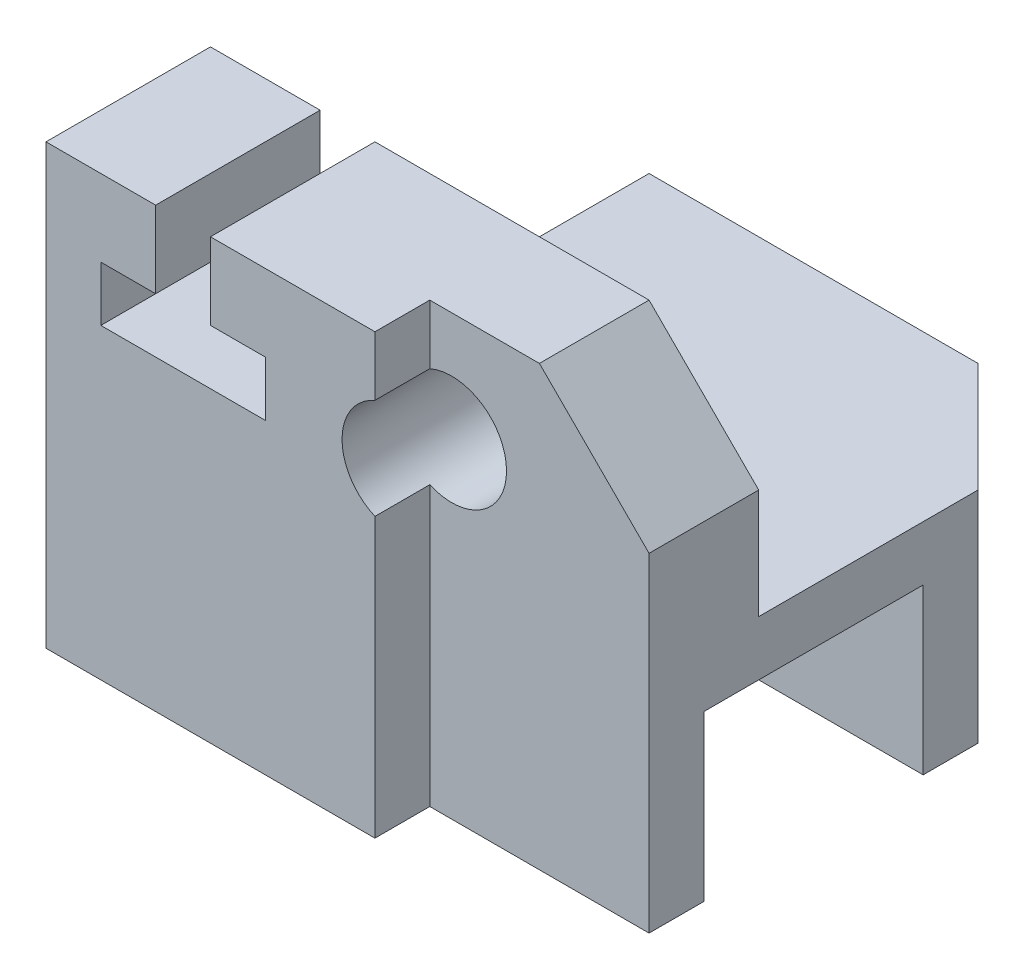
ISO-10303-21;
HEADER;
FILE_DESCRIPTION(('STEP AP214'),'2;1');
FILE_NAME('part.step','',(''),(''),'','','');
FILE_SCHEMA(('AUTOMOTIVE_DESIGN { 1 0 10303 214 1 1 1 1 }'));
ENDSEC;
DATA;
#1=APPLICATION_CONTEXT('core data for automotive mechanical design processes');
#2=APPLICATION_PROTOCOL_DEFINITION('international standard','automotive_design',2000,#1);
#3=PRODUCT_CONTEXT('',#1,'mechanical');
#4=PRODUCT('Part','Part','',(#3));
#5=PRODUCT_RELATED_PRODUCT_CATEGORY('part','',(#4));
#6=PRODUCT_DEFINITION_FORMATION('','',#4);
#7=PRODUCT_DEFINITION_CONTEXT('part definition',#1,'design');
#8=PRODUCT_DEFINITION('design','',#6,#7);
#9=PRODUCT_DEFINITION_SHAPE('','',#8);
#10=(LENGTH_UNIT() NAMED_UNIT(*) SI_UNIT(.MILLI.,.METRE.));
#11=(NAMED_UNIT(*) PLANE_ANGLE_UNIT() SI_UNIT($,.RADIAN.));
#12=(NAMED_UNIT(*) SI_UNIT($,.STERADIAN.) SOLID_ANGLE_UNIT());
#13=UNCERTAINTY_MEASURE_WITH_UNIT(LENGTH_MEASURE(1.E-05),#10,'distance_accuracy_value','');
#14=(GEOMETRIC_REPRESENTATION_CONTEXT(3) GLOBAL_UNCERTAINTY_ASSIGNED_CONTEXT((#13)) GLOBAL_UNIT_ASSIGNED_CONTEXT((#10,
#11,#12)) REPRESENTATION_CONTEXT('',''));
#15=CARTESIAN_POINT('',(0.,0.,0.));
#16=DIRECTION('',(0.,0.,1.));
#17=DIRECTION('',(1.,0.,0.));
#18=AXIS2_PLACEMENT_3D('',#15,#16,#17);
#19=CARTESIAN_POINT('',(-59.1833674934599,0.,0.));
#20=DIRECTION('',(1.,0.,0.));
#21=DIRECTION('',(0.,0.,-1.));
#22=AXIS2_PLACEMENT_3D('',#19,#20,#21);
#23=PLANE('',#22);
#24=DIRECTION('',(0.,0.,-1.));
#25=VECTOR('',#24,1.);
#26=CARTESIAN_POINT('',(-59.1833674934599,-29.4280032993977,22.5));
#27=LINE('',#26,#25);
#28=CARTESIAN_POINT('',(-59.1833674934599,-29.4280032993977,22.5));
#29=VERTEX_POINT('',#28);
#30=CARTESIAN_POINT('',(-59.1833674934599,-29.4280032993977,17.5));
#31=VERTEX_POINT('',#30);
#32=EDGE_CURVE('E11',#29,#31,#27,.T.);
#33=ORIENTED_EDGE('',*,*,#32,.F.);
#34=DIRECTION('',(0.,-1.,0.));
#35=VECTOR('',#34,1.);
#36=CARTESIAN_POINT('',(-59.1833674934599,-14.8454276044418,22.5));
#37=LINE('',#36,#35);
#38=CARTESIAN_POINT('',(-59.1833674934599,-54.8454276044418,22.5));
#39=VERTEX_POINT('',#38);
#40=EDGE_CURVE('E247',#29,#39,#37,.T.);
#41=ORIENTED_EDGE('',*,*,#40,.T.);
#42=DIRECTION('',(0.,0.,-1.));
#43=VECTOR('',#42,1.);
#44=CARTESIAN_POINT('',(-59.1833674934599,-54.8454276044418,22.5));
#45=LINE('',#44,#43);
#46=CARTESIAN_POINT('',(-59.1833674934599,-54.8454276044418,17.5));
#47=VERTEX_POINT('',#46);
#48=EDGE_CURVE('E253',#39,#47,#45,.T.);
#49=ORIENTED_EDGE('',*,*,#48,.T.);
#50=DIRECTION('',(0.,1.,0.));
#51=VECTOR('',#50,1.);
#52=CARTESIAN_POINT('',(-59.1833674934599,-14.8454276044418,17.5));
#53=LINE('',#52,#51);
#54=EDGE_CURVE('E263',#47,#31,#53,.T.);
#55=ORIENTED_EDGE('',*,*,#54,.T.);
#56=EDGE_LOOP('',(#33,#41,#49,#55));
#57=FACE_BOUND('',#56,.T.);
#58=ADVANCED_FACE('F40',(#57),#23,.T.);
#59=CARTESIAN_POINT('',(-89.1833674934599,-54.8454276044418,22.5));
#60=DIRECTION('',(0.,1.,0.));
#61=DIRECTION('',(0.,0.,1.));
#62=AXIS2_PLACEMENT_3D('',#59,#60,#61);
#63=PLANE('',#62);
#64=DIRECTION('',(1.,0.,0.));
#65=VECTOR('',#64,1.);
#66=CARTESIAN_POINT('',(-64.1833674934599,-54.8454276044418,-7.50000000000001));
#67=LINE('',#66,#65);
#68=CARTESIAN_POINT('',(-54.1833674934599,-54.8454276044418,-7.50000000000001));
#69=VERTEX_POINT('',#68);
#70=CARTESIAN_POINT('',(-39.1833674934599,-54.8454276044418,-7.50000000000001));
#71=VERTEX_POINT('',#70);
#72=EDGE_CURVE('E63',#69,#71,#67,.T.);
#73=ORIENTED_EDGE('',*,*,#72,.F.);
#74=DIRECTION('',(0.,0.,-1.));
#75=VECTOR('',#74,1.);
#76=CARTESIAN_POINT('',(-54.1833674934599,-54.8454276044418,2.5));
#77=LINE('',#76,#75);
#78=CARTESIAN_POINT('',(-54.1833674934599,-54.8454276044418,-22.5));
#79=VERTEX_POINT('',#78);
#80=EDGE_CURVE('E349',#69,#79,#77,.T.);
#81=ORIENTED_EDGE('',*,*,#80,.T.);
#82=DIRECTION('',(1.,0.,0.));
#83=VECTOR('',#82,1.);
#84=CARTESIAN_POINT('',(-89.1833674934599,-54.8454276044418,-22.5));
#85=LINE('',#84,#83);
#86=CARTESIAN_POINT('',(-49.1833674934599,-54.8454276044418,-22.5));
#87=VERTEX_POINT('',#86);
#88=EDGE_CURVE('E308',#79,#87,#85,.T.);
#89=ORIENTED_EDGE('',*,*,#88,.T.);
#90=DIRECTION('',(0.707106781186548,0.,0.707106781186547));
#91=VECTOR('',#90,1.);
#92=CARTESIAN_POINT('',(-39.1833674934599,-54.8454276044418,-12.5));
#93=LINE('',#92,#91);
#94=CARTESIAN_POINT('',(-39.1833674934599,-54.8454276044418,-12.5));
#95=VERTEX_POINT('',#94);
#96=EDGE_CURVE('E337',#87,#95,#93,.T.);
#97=ORIENTED_EDGE('',*,*,#96,.T.);
#98=DIRECTION('',(0.,0.,-1.));
#99=VECTOR('',#98,1.);
#100=CARTESIAN_POINT('',(-39.1833674934599,-54.8454276044418,22.5));
#101=LINE('',#100,#99);
#102=EDGE_CURVE('E313',#71,#95,#101,.T.);
#103=ORIENTED_EDGE('',*,*,#102,.F.);
#104=EDGE_LOOP('',(#73,#81,#89,#97,#103));
#105=FACE_BOUND('',#104,.T.);
#106=ADVANCED_FACE('F348',(#105),#63,.F.);
#107=CARTESIAN_POINT('',(-89.1833674934599,-14.8454276044418,22.5));
#108=DIRECTION('',(0.,-1.,0.));
#109=DIRECTION('',(0.,0.,-1.));
#110=AXIS2_PLACEMENT_3D('',#107,#108,#109);
#111=PLANE('',#110);
#112=DIRECTION('',(1.,0.,0.));
#113=VECTOR('',#112,1.);
#114=CARTESIAN_POINT('',(-89.1833674934599,-14.8454276044418,7.5));
#115=LINE('',#114,#113);
#116=CARTESIAN_POINT('',(-74.1833674934599,-14.8454276044418,7.5));
#117=VERTEX_POINT('',#116);
#118=CARTESIAN_POINT('',(-49.1833674934599,-14.8454276044418,7.5));
#119=VERTEX_POINT('',#118);
#120=EDGE_CURVE('E283',#117,#119,#115,.T.);
#121=ORIENTED_EDGE('',*,*,#120,.F.);
#122=DIRECTION('',(0.,0.,-1.));
#123=VECTOR('',#122,1.);
#124=CARTESIAN_POINT('',(-74.1833674934599,-14.8454276044418,22.5));
#125=LINE('',#124,#123);
#126=CARTESIAN_POINT('',(-74.1833674934599,-14.8454276044418,22.5));
#127=VERTEX_POINT('',#126);
#128=EDGE_CURVE('E401',#127,#117,#125,.T.);
#129=ORIENTED_EDGE('',*,*,#128,.F.);
#130=DIRECTION('',(-1.,0.,0.));
#131=VECTOR('',#130,1.);
#132=CARTESIAN_POINT('',(-89.1833674934599,-14.8454276044418,22.5));
#133=LINE('',#132,#131);
#134=CARTESIAN_POINT('',(-59.1833674934599,-14.8454276044418,22.5));
#135=VERTEX_POINT('',#134);
#136=EDGE_CURVE('E304',#135,#127,#133,.T.);
#137=ORIENTED_EDGE('',*,*,#136,.F.);
#138=DIRECTION('',(0.,0.,1.));
#139=VECTOR('',#138,1.);
#140=CARTESIAN_POINT('',(-59.1833674934599,-14.8454276044418,22.5));
#141=LINE('',#140,#139);
#142=CARTESIAN_POINT('',(-59.1833674934599,-14.8454276044418,17.5));
#143=VERTEX_POINT('',#142);
#144=EDGE_CURVE('E252',#143,#135,#141,.T.);
#145=ORIENTED_EDGE('',*,*,#144,.F.);
#146=DIRECTION('',(1.,0.,0.));
#147=VECTOR('',#146,1.);
#148=CARTESIAN_POINT('',(-59.1833674934599,-14.8454276044418,17.5));
#149=LINE('',#148,#147);
#150=CARTESIAN_POINT('',(-49.1833674934599,-14.8454276044418,17.5));
#151=VERTEX_POINT('',#150);
#152=EDGE_CURVE('E271',#143,#151,#149,.T.);
#153=ORIENTED_EDGE('',*,*,#152,.T.);
#154=DIRECTION('',(0.,0.,-1.));
#155=VECTOR('',#154,1.);
#156=CARTESIAN_POINT('',(-49.1833674934599,-14.8454276044418,22.5));
#157=LINE('',#156,#155);
#158=EDGE_CURVE('E320',#151,#119,#157,.T.);
#159=ORIENTED_EDGE('',*,*,#158,.T.);
#160=EDGE_LOOP('',(#121,#129,#137,#145,#153,#159));
#161=FACE_BOUND('',#160,.T.);
#162=ADVANCED_FACE('F545',(#161),#111,.F.);
#163=CARTESIAN_POINT('',(0.,0.,22.5));
#164=DIRECTION('',(0.,0.,-1.));
#165=DIRECTION('',(-1.,0.,0.));
#166=AXIS2_PLACEMENT_3D('',#163,#164,#165);
#167=PLANE('',#166);
#168=ORIENTED_EDGE('',*,*,#40,.F.);
#169=CARTESIAN_POINT('',(-57.1833674934599,-24.8454276044418,22.5));
#170=DIRECTION('',(0.,0.,-1.));
#171=DIRECTION('',(-1.,0.,0.));
#172=AXIS2_PLACEMENT_3D('',#169,#170,#171);
#173=CIRCLE('',#172,5.);
#174=CARTESIAN_POINT('',(-59.1833674934599,-20.262851909486,22.5));
#175=VERTEX_POINT('',#174);
#176=EDGE_CURVE('E233',#29,#175,#173,.T.);
#177=ORIENTED_EDGE('',*,*,#176,.T.);
#178=EDGE_CURVE('E244',#135,#175,#37,.T.);
#179=ORIENTED_EDGE('',*,*,#178,.F.);
#180=ORIENTED_EDGE('',*,*,#136,.T.);
#181=DIRECTION('',(0.,-1.,0.));
#182=VECTOR('',#181,1.);
#183=CARTESIAN_POINT('',(-74.1833674934599,-14.8454276044418,22.5));
#184=LINE('',#183,#182);
#185=CARTESIAN_POINT('',(-74.1833674934599,-21.8454276044418,22.5));
#186=VERTEX_POINT('',#185);
#187=EDGE_CURVE('E360',#127,#186,#184,.T.);
#188=ORIENTED_EDGE('',*,*,#187,.T.);
#189=DIRECTION('',(1.,0.,0.));
#190=VECTOR('',#189,1.);
#191=CARTESIAN_POINT('',(-69.1833674934599,-21.8454276044418,22.5));
#192=LINE('',#191,#190);
#193=CARTESIAN_POINT('',(-69.1833674934599,-21.8454276044418,22.5));
#194=VERTEX_POINT('',#193);
#195=EDGE_CURVE('E363',#186,#194,#192,.T.);
#196=ORIENTED_EDGE('',*,*,#195,.T.);
#197=DIRECTION('',(0.,-1.,0.));
#198=VECTOR('',#197,1.);
#199=CARTESIAN_POINT('',(-69.1833674934599,-21.8454276044418,22.5));
#200=LINE('',#199,#198);
#201=CARTESIAN_POINT('',(-69.1833674934599,-26.8454276044418,22.5));
#202=VERTEX_POINT('',#201);
#203=EDGE_CURVE('E367',#194,#202,#200,.T.);
#204=ORIENTED_EDGE('',*,*,#203,.T.);
#205=DIRECTION('',(-1.,0.,0.));
#206=VECTOR('',#205,1.);
#207=CARTESIAN_POINT('',(-69.1833674934599,-26.8454276044418,22.5));
#208=LINE('',#207,#206);
#209=CARTESIAN_POINT('',(-84.1833674934599,-26.8454276044418,22.5));
#210=VERTEX_POINT('',#209);
#211=EDGE_CURVE('E370',#202,#210,#208,.T.);
#212=ORIENTED_EDGE('',*,*,#211,.T.);
#213=DIRECTION('',(0.,1.,0.));
#214=VECTOR('',#213,1.);
#215=CARTESIAN_POINT('',(-84.1833674934599,-21.8454276044418,22.5));
#216=LINE('',#215,#214);
#217=CARTESIAN_POINT('',(-84.1833674934599,-21.8454276044418,22.5));
#218=VERTEX_POINT('',#217);
#219=EDGE_CURVE('E373',#210,#218,#216,.T.);
#220=ORIENTED_EDGE('',*,*,#219,.T.);
#221=DIRECTION('',(1.,0.,0.));
#222=VECTOR('',#221,1.);
#223=CARTESIAN_POINT('',(-79.1833674934599,-21.8454276044418,22.5));
#224=LINE('',#223,#222);
#225=CARTESIAN_POINT('',(-79.1833674934599,-21.8454276044418,22.5));
#226=VERTEX_POINT('',#225);
#227=EDGE_CURVE('E376',#218,#226,#224,.T.);
#228=ORIENTED_EDGE('',*,*,#227,.T.);
#229=DIRECTION('',(0.,1.,0.));
#230=VECTOR('',#229,1.);
#231=CARTESIAN_POINT('',(-79.1833674934599,-14.8454276044418,22.5));
#232=LINE('',#231,#230);
#233=CARTESIAN_POINT('',(-79.1833674934599,-14.8454276044418,22.5));
#234=VERTEX_POINT('',#233);
#235=EDGE_CURVE('E379',#226,#234,#232,.T.);
#236=ORIENTED_EDGE('',*,*,#235,.T.);
#237=CARTESIAN_POINT('',(-89.1833674934599,-14.8454276044418,22.5));
#238=VERTEX_POINT('',#237);
#239=EDGE_CURVE('E303',#234,#238,#133,.T.);
#240=ORIENTED_EDGE('',*,*,#239,.T.);
#241=DIRECTION('',(0.,-1.,0.));
#242=VECTOR('',#241,1.);
#243=CARTESIAN_POINT('',(-89.1833674934599,-54.8454276044418,22.5));
#244=LINE('',#243,#242);
#245=CARTESIAN_POINT('',(-89.1833674934599,-54.8454276044418,22.5));
#246=VERTEX_POINT('',#245);
#247=EDGE_CURVE('E297',#238,#246,#244,.T.);
#248=ORIENTED_EDGE('',*,*,#247,.T.);
#249=DIRECTION('',(1.,0.,0.));
#250=VECTOR('',#249,1.);
#251=CARTESIAN_POINT('',(-89.1833674934599,-54.8454276044418,22.5));
#252=LINE('',#251,#250);
#253=EDGE_CURVE('E300',#246,#39,#252,.T.);
#254=ORIENTED_EDGE('',*,*,#253,.T.);
#255=EDGE_LOOP('',(#168,#177,#179,#180,#188,#196,#204,#212,#220,#228,#236,#240,#248,#254));
#256=FACE_BOUND('',#255,.T.);
#257=ADVANCED_FACE('F242',(#256),#167,.F.);
#258=CARTESIAN_POINT('',(-89.1833674934599,-54.8454276044418,22.5));
#259=DIRECTION('',(1.,0.,0.));
#260=DIRECTION('',(0.,0.,-1.));
#261=AXIS2_PLACEMENT_3D('',#258,#259,#260);
#262=PLANE('',#261);
#263=DIRECTION('',(0.,0.,-1.));
#264=VECTOR('',#263,1.);
#265=CARTESIAN_POINT('',(-89.1833674934599,-34.8454276044418,-22.5));
#266=LINE('',#265,#264);
#267=CARTESIAN_POINT('',(-89.1833674934599,-34.8454276044418,7.5));
#268=VERTEX_POINT('',#267);
#269=CARTESIAN_POINT('',(-89.1833674934599,-34.8454276044418,-7.5));
#270=VERTEX_POINT('',#269);
#271=EDGE_CURVE('E279',#268,#270,#266,.T.);
#272=ORIENTED_EDGE('',*,*,#271,.T.);
#273=DIRECTION('',(0.,1.,0.));
#274=VECTOR('',#273,1.);
#275=CARTESIAN_POINT('',(-89.1833674934599,-34.8454276044418,-7.5));
#276=LINE('',#275,#274);
#277=CARTESIAN_POINT('',(-89.1833674934599,-44.8454276044418,-7.5));
#278=VERTEX_POINT('',#277);
#279=EDGE_CURVE('E423',#278,#270,#276,.T.);
#280=ORIENTED_EDGE('',*,*,#279,.F.);
#281=DIRECTION('',(0.,0.,1.));
#282=VECTOR('',#281,1.);
#283=CARTESIAN_POINT('',(-89.1833674934599,-44.8454276044418,-22.5));
#284=LINE('',#283,#282);
#285=CARTESIAN_POINT('',(-89.1833674934599,-44.8454276044418,-22.5));
#286=VERTEX_POINT('',#285);
#287=EDGE_CURVE('E403',#286,#278,#284,.T.);
#288=ORIENTED_EDGE('',*,*,#287,.F.);
#289=DIRECTION('',(0.,-1.,0.));
#290=VECTOR('',#289,1.);
#291=CARTESIAN_POINT('',(-89.1833674934599,-54.8454276044418,-22.5));
#292=LINE('',#291,#290);
#293=CARTESIAN_POINT('',(-89.1833674934599,-54.8454276044418,-22.5));
#294=VERTEX_POINT('',#293);
#295=EDGE_CURVE('E290',#286,#294,#292,.T.);
#296=ORIENTED_EDGE('',*,*,#295,.T.);
#297=DIRECTION('',(0.,0.,-1.));
#298=VECTOR('',#297,1.);
#299=CARTESIAN_POINT('',(-89.1833674934599,-54.8454276044418,22.5));
#300=LINE('',#299,#298);
#301=EDGE_CURVE('E317',#246,#294,#300,.T.);
#302=ORIENTED_EDGE('',*,*,#301,.F.);
#303=ORIENTED_EDGE('',*,*,#247,.F.);
#304=DIRECTION('',(0.,0.,-1.));
#305=VECTOR('',#304,1.);
#306=CARTESIAN_POINT('',(-89.1833674934599,-14.8454276044418,22.5));
#307=LINE('',#306,#305);
#308=CARTESIAN_POINT('',(-89.1833674934599,-14.8454276044418,7.5));
#309=VERTEX_POINT('',#308);
#310=EDGE_CURVE('E306',#238,#309,#307,.T.);
#311=ORIENTED_EDGE('',*,*,#310,.T.);
#312=DIRECTION('',(0.,-1.,0.));
#313=VECTOR('',#312,1.);
#314=CARTESIAN_POINT('',(-89.1833674934599,-14.8454276044418,7.5));
#315=LINE('',#314,#313);
#316=EDGE_CURVE('E276',#309,#268,#315,.T.);
#317=ORIENTED_EDGE('',*,*,#316,.T.);
#318=EDGE_LOOP('',(#272,#280,#288,#296,#302,#303,#311,#317));
#319=FACE_BOUND('',#318,.T.);
#320=ADVANCED_FACE('F446',(#319),#262,.F.);
#321=CARTESIAN_POINT('',(-74.1833674934599,-54.8454276044418,-3.5));
#322=DIRECTION('',(0.,1.,0.));
#323=DIRECTION('',(0.,0.,1.));
#324=AXIS2_PLACEMENT_3D('',#321,#322,#323);
#325=CIRCLE('',#324,3.00000000000001);
#326=CARTESIAN_POINT('',(-74.1833674934599,-54.8454276044418,-0.499999999999992));
#327=VERTEX_POINT('',#326);
#328=EDGE_CURVE('E493',#327,#327,#325,.T.);
#329=ORIENTED_EDGE('',*,*,#328,.T.);
#330=EDGE_LOOP('',(#329));
#331=FACE_BOUND('',#330,.T.);
#332=CARTESIAN_POINT('',(-64.1833674934599,-54.8454276044418,-22.5));
#333=VERTEX_POINT('',#332);
#334=EDGE_CURVE('E301',#294,#333,#85,.T.);
#335=ORIENTED_EDGE('',*,*,#334,.T.);
#336=DIRECTION('',(0.,0.,-1.));
#337=VECTOR('',#336,1.);
#338=CARTESIAN_POINT('',(-64.1833674934599,-54.8454276044418,12.5));
#339=LINE('',#338,#337);
#340=CARTESIAN_POINT('',(-64.1833674934599,-54.8454276044418,12.5));
#341=VERTEX_POINT('',#340);
#342=EDGE_CURVE('E509',#341,#333,#339,.T.);
#343=ORIENTED_EDGE('',*,*,#342,.F.);
#344=DIRECTION('',(1.,0.,0.));
#345=VECTOR('',#344,1.);
#346=CARTESIAN_POINT('',(-64.1833674934599,-54.8454276044418,12.5));
#347=LINE('',#346,#345);
#348=CARTESIAN_POINT('',(-39.1833674934599,-54.8454276044418,12.5));
#349=VERTEX_POINT('',#348);
#350=EDGE_CURVE('E351',#341,#349,#347,.T.);
#351=ORIENTED_EDGE('',*,*,#350,.T.);
#352=CARTESIAN_POINT('',(-39.1833674934599,-54.8454276044418,17.5));
#353=VERTEX_POINT('',#352);
#354=EDGE_CURVE('E314',#353,#349,#101,.T.);
#355=ORIENTED_EDGE('',*,*,#354,.F.);
#356=DIRECTION('',(1.,0.,0.));
#357=VECTOR('',#356,1.);
#358=CARTESIAN_POINT('',(-59.1833674934599,-54.8454276044418,17.5));
#359=LINE('',#358,#357);
#360=EDGE_CURVE('E267',#47,#353,#359,.T.);
#361=ORIENTED_EDGE('',*,*,#360,.F.);
#362=ORIENTED_EDGE('',*,*,#48,.F.);
#363=ORIENTED_EDGE('',*,*,#253,.F.);
#364=ORIENTED_EDGE('',*,*,#301,.T.);
#365=EDGE_LOOP('',(#335,#343,#351,#355,#361,#362,#363,#364));
#366=FACE_BOUND('',#365,.T.);
#367=ADVANCED_FACE('F457',(#331,#366),#63,.F.);
#368=CARTESIAN_POINT('',(-39.1833674934599,-54.8454276044418,22.5));
#369=DIRECTION('',(-1.,0.,0.));
#370=DIRECTION('',(0.,0.,1.));
#371=AXIS2_PLACEMENT_3D('',#368,#369,#370);
#372=PLANE('',#371);
#373=ORIENTED_EDGE('',*,*,#354,.T.);
#374=DIRECTION('',(0.,-1.,0.));
#375=VECTOR('',#374,1.);
#376=CARTESIAN_POINT('',(-39.1833674934599,-54.8454276044418,12.5));
#377=LINE('',#376,#375);
#378=CARTESIAN_POINT('',(-39.1833674934599,-39.8454276044418,12.5));
#379=VERTEX_POINT('',#378);
#380=EDGE_CURVE('E504',#379,#349,#377,.T.);
#381=ORIENTED_EDGE('',*,*,#380,.F.);
#382=DIRECTION('',(0.,0.,1.));
#383=VECTOR('',#382,1.);
#384=CARTESIAN_POINT('',(-39.1833674934599,-39.8454276044418,12.5));
#385=LINE('',#384,#383);
#386=CARTESIAN_POINT('',(-39.1833674934599,-39.8454276044418,-7.50000000000001));
#387=VERTEX_POINT('',#386);
#388=EDGE_CURVE('E510',#387,#379,#385,.T.);
#389=ORIENTED_EDGE('',*,*,#388,.F.);
#390=DIRECTION('',(0.,1.,0.));
#391=VECTOR('',#390,1.);
#392=CARTESIAN_POINT('',(-39.1833674934599,-54.8454276044418,-7.50000000000001));
#393=LINE('',#392,#391);
#394=EDGE_CURVE('E489',#71,#387,#393,.T.);
#395=ORIENTED_EDGE('',*,*,#394,.F.);
#396=ORIENTED_EDGE('',*,*,#102,.T.);
#397=DIRECTION('',(0.,1.,0.));
#398=VECTOR('',#397,1.);
#399=CARTESIAN_POINT('',(-39.1833674934599,-34.8454276044418,-12.5));
#400=LINE('',#399,#398);
#401=CARTESIAN_POINT('',(-39.1833674934599,-34.8454276044418,-12.5));
#402=VERTEX_POINT('',#401);
#403=EDGE_CURVE('E329',#95,#402,#400,.T.);
#404=ORIENTED_EDGE('',*,*,#403,.T.);
#405=DIRECTION('',(0.,0.,-1.));
#406=VECTOR('',#405,1.);
#407=CARTESIAN_POINT('',(-39.1833674934599,-34.8454276044418,-22.5));
#408=LINE('',#407,#406);
#409=CARTESIAN_POINT('',(-39.1833674934599,-34.8454276044418,7.5));
#410=VERTEX_POINT('',#409);
#411=EDGE_CURVE('E280',#410,#402,#408,.T.);
#412=ORIENTED_EDGE('',*,*,#411,.F.);
#413=DIRECTION('',(0.,-1.,0.));
#414=VECTOR('',#413,1.);
#415=CARTESIAN_POINT('',(-39.1833674934599,-14.8454276044418,7.5));
#416=LINE('',#415,#414);
#417=CARTESIAN_POINT('',(-39.1833674934599,-24.8454276044419,7.5));
#418=VERTEX_POINT('',#417);
#419=EDGE_CURVE('E274',#418,#410,#416,.T.);
#420=ORIENTED_EDGE('',*,*,#419,.F.);
#421=DIRECTION('',(0.,0.,1.));
#422=VECTOR('',#421,1.);
#423=CARTESIAN_POINT('',(-39.1833674934599,-24.8454276044419,22.5));
#424=LINE('',#423,#422);
#425=CARTESIAN_POINT('',(-39.1833674934599,-24.8454276044419,17.5));
#426=VERTEX_POINT('',#425);
#427=EDGE_CURVE('E325',#418,#426,#424,.T.);
#428=ORIENTED_EDGE('',*,*,#427,.T.);
#429=DIRECTION('',(0.,1.,0.));
#430=VECTOR('',#429,1.);
#431=CARTESIAN_POINT('',(-39.1833674934599,-14.8454276044418,17.5));
#432=LINE('',#431,#430);
#433=EDGE_CURVE('E258',#353,#426,#432,.T.);
#434=ORIENTED_EDGE('',*,*,#433,.F.);
#435=EDGE_LOOP('',(#373,#381,#389,#395,#396,#404,#412,#420,#428,#434));
#436=FACE_BOUND('',#435,.T.);
#437=ADVANCED_FACE('F486',(#436),#372,.F.);
#438=ORIENTED_EDGE('',*,*,#239,.F.);
#439=DIRECTION('',(0.,0.,-1.));
#440=VECTOR('',#439,1.);
#441=CARTESIAN_POINT('',(-79.1833674934599,-14.8454276044418,22.5));
#442=LINE('',#441,#440);
#443=CARTESIAN_POINT('',(-79.1833674934599,-14.8454276044418,7.5));
#444=VERTEX_POINT('',#443);
#445=EDGE_CURVE('E404',#234,#444,#442,.T.);
#446=ORIENTED_EDGE('',*,*,#445,.T.);
#447=EDGE_CURVE('E294',#309,#444,#115,.T.);
#448=ORIENTED_EDGE('',*,*,#447,.F.);
#449=ORIENTED_EDGE('',*,*,#310,.F.);
#450=EDGE_LOOP('',(#438,#446,#448,#449));
#451=FACE_BOUND('',#450,.T.);
#452=ADVANCED_FACE('F465',(#451),#111,.F.);
#453=CARTESIAN_POINT('',(0.,0.,-22.5));
#454=DIRECTION('',(0.,0.,-1.));
#455=DIRECTION('',(-1.,0.,0.));
#456=AXIS2_PLACEMENT_3D('',#453,#454,#455);
#457=PLANE('',#456);
#458=DIRECTION('',(0.,-1.,0.));
#459=VECTOR('',#458,1.);
#460=CARTESIAN_POINT('',(-54.1833674934599,-54.8454276044418,-22.5));
#461=LINE('',#460,#459);
#462=CARTESIAN_POINT('',(-54.1833674934599,-39.8454276044418,-22.5));
#463=VERTEX_POINT('',#462);
#464=EDGE_CURVE('E490',#463,#79,#461,.T.);
#465=ORIENTED_EDGE('',*,*,#464,.F.);
#466=DIRECTION('',(1.,0.,0.));
#467=VECTOR('',#466,1.);
#468=CARTESIAN_POINT('',(-54.1833674934599,-39.8454276044418,-22.5));
#469=LINE('',#468,#467);
#470=CARTESIAN_POINT('',(-64.1833674934599,-39.8454276044418,-22.5));
#471=VERTEX_POINT('',#470);
#472=EDGE_CURVE('E492',#471,#463,#469,.T.);
#473=ORIENTED_EDGE('',*,*,#472,.F.);
#474=DIRECTION('',(0.,1.,0.));
#475=VECTOR('',#474,1.);
#476=CARTESIAN_POINT('',(-64.1833674934599,-54.8454276044418,-22.5));
#477=LINE('',#476,#475);
#478=EDGE_CURVE('E454',#333,#471,#477,.T.);
#479=ORIENTED_EDGE('',*,*,#478,.F.);
#480=ORIENTED_EDGE('',*,*,#334,.F.);
#481=ORIENTED_EDGE('',*,*,#295,.F.);
#482=DIRECTION('',(-1.,0.,0.));
#483=VECTOR('',#482,1.);
#484=CARTESIAN_POINT('',(-79.1833674934599,-44.8454276044418,-22.5));
#485=LINE('',#484,#483);
#486=CARTESIAN_POINT('',(-79.1833674934599,-44.8454276044418,-22.5));
#487=VERTEX_POINT('',#486);
#488=EDGE_CURVE('E260',#487,#286,#485,.T.);
#489=ORIENTED_EDGE('',*,*,#488,.F.);
#490=DIRECTION('',(0.,-1.,0.));
#491=VECTOR('',#490,1.);
#492=CARTESIAN_POINT('',(-79.1833674934599,-34.8454276044418,-22.5));
#493=LINE('',#492,#491);
#494=CARTESIAN_POINT('',(-79.1833674934599,-34.8454276044418,-22.5));
#495=VERTEX_POINT('',#494);
#496=EDGE_CURVE('E419',#495,#487,#493,.T.);
#497=ORIENTED_EDGE('',*,*,#496,.F.);
#498=DIRECTION('',(1.,0.,0.));
#499=VECTOR('',#498,1.);
#500=CARTESIAN_POINT('',(-89.1833674934599,-34.8454276044418,-22.5));
#501=LINE('',#500,#499);
#502=CARTESIAN_POINT('',(-49.1833674934599,-34.8454276044418,-22.5));
#503=VERTEX_POINT('',#502);
#504=EDGE_CURVE('E287',#495,#503,#501,.T.);
#505=ORIENTED_EDGE('',*,*,#504,.T.);
#506=DIRECTION('',(0.,-1.,0.));
#507=VECTOR('',#506,1.);
#508=CARTESIAN_POINT('',(-49.1833674934599,-54.8454276044418,-22.5));
#509=LINE('',#508,#507);
#510=EDGE_CURVE('E334',#503,#87,#509,.T.);
#511=ORIENTED_EDGE('',*,*,#510,.T.);
#512=ORIENTED_EDGE('',*,*,#88,.F.);
#513=EDGE_LOOP('',(#465,#473,#479,#480,#481,#489,#497,#505,#511,#512));
#514=FACE_BOUND('',#513,.T.);
#515=ADVANCED_FACE('F450',(#514),#457,.T.);
#516=CARTESIAN_POINT('',(-89.1833674934599,-34.8454276044418,-22.5));
#517=DIRECTION('',(0.,-1.,0.));
#518=DIRECTION('',(0.,0.,-1.));
#519=AXIS2_PLACEMENT_3D('',#516,#517,#518);
#520=PLANE('',#519);
#521=CARTESIAN_POINT('',(-74.1833674934599,-34.8454276044418,-3.5));
#522=DIRECTION('',(0.,1.,0.));
#523=DIRECTION('',(0.,0.,1.));
#524=AXIS2_PLACEMENT_3D('',#521,#522,#523);
#525=CIRCLE('',#524,3.00000000000001);
#526=CARTESIAN_POINT('',(-74.1833674934599,-34.8454276044418,-0.499999999999992));
#527=VERTEX_POINT('',#526);
#528=EDGE_CURVE('E497',#527,#527,#525,.T.);
#529=ORIENTED_EDGE('',*,*,#528,.F.);
#530=EDGE_LOOP('',(#529));
#531=FACE_BOUND('',#530,.T.);
#532=ORIENTED_EDGE('',*,*,#411,.T.);
#533=DIRECTION('',(-0.707106781186548,0.,-0.707106781186547));
#534=VECTOR('',#533,1.);
#535=CARTESIAN_POINT('',(-39.1833674934599,-34.8454276044418,-12.5));
#536=LINE('',#535,#534);
#537=EDGE_CURVE('E332',#402,#503,#536,.T.);
#538=ORIENTED_EDGE('',*,*,#537,.T.);
#539=ORIENTED_EDGE('',*,*,#504,.F.);
#540=DIRECTION('',(0.,0.,-1.));
#541=VECTOR('',#540,1.);
#542=CARTESIAN_POINT('',(-79.1833674934599,-34.8454276044418,-22.5));
#543=LINE('',#542,#541);
#544=CARTESIAN_POINT('',(-79.1833674934599,-34.8454276044418,-7.5));
#545=VERTEX_POINT('',#544);
#546=EDGE_CURVE('E428',#545,#495,#543,.T.);
#547=ORIENTED_EDGE('',*,*,#546,.F.);
#548=DIRECTION('',(-1.,0.,0.));
#549=VECTOR('',#548,1.);
#550=CARTESIAN_POINT('',(-79.1833674934599,-34.8454276044418,-7.5));
#551=LINE('',#550,#549);
#552=EDGE_CURVE('E270',#545,#270,#551,.T.);
#553=ORIENTED_EDGE('',*,*,#552,.T.);
#554=ORIENTED_EDGE('',*,*,#271,.F.);
#555=DIRECTION('',(1.,0.,0.));
#556=VECTOR('',#555,1.);
#557=CARTESIAN_POINT('',(-89.1833674934599,-34.8454276044418,7.5));
#558=LINE('',#557,#556);
#559=EDGE_CURVE('E291',#268,#410,#558,.T.);
#560=ORIENTED_EDGE('',*,*,#559,.T.);
#561=EDGE_LOOP('',(#532,#538,#539,#547,#553,#554,#560));
#562=FACE_BOUND('',#561,.T.);
#563=ADVANCED_FACE('F473',(#531,#562),#520,.F.);
#564=CARTESIAN_POINT('',(-89.1833674934599,-14.8454276044418,7.5));
#565=DIRECTION('',(0.,0.,1.));
#566=DIRECTION('',(1.,0.,0.));
#567=AXIS2_PLACEMENT_3D('',#564,#565,#566);
#568=PLANE('',#567);
#569=CARTESIAN_POINT('',(-57.1833674934599,-24.8454276044418,7.5));
#570=DIRECTION('',(0.,0.,-1.));
#571=DIRECTION('',(-1.,0.,0.));
#572=AXIS2_PLACEMENT_3D('',#569,#570,#571);
#573=CIRCLE('',#572,5.);
#574=CARTESIAN_POINT('',(-62.1833674934599,-24.8454276044418,7.5));
#575=VERTEX_POINT('',#574);
#576=EDGE_CURVE('E248',#575,#575,#573,.T.);
#577=ORIENTED_EDGE('',*,*,#576,.F.);
#578=EDGE_LOOP('',(#577));
#579=FACE_BOUND('',#578,.T.);
#580=DIRECTION('',(1.,0.,0.));
#581=VECTOR('',#580,1.);
#582=CARTESIAN_POINT('',(-69.1833674934599,-21.8454276044418,7.5));
#583=LINE('',#582,#581);
#584=CARTESIAN_POINT('',(-74.1833674934599,-21.8454276044418,7.5));
#585=VERTEX_POINT('',#584);
#586=CARTESIAN_POINT('',(-69.1833674934599,-21.8454276044418,7.5));
#587=VERTEX_POINT('',#586);
#588=EDGE_CURVE('E385',#585,#587,#583,.T.);
#589=ORIENTED_EDGE('',*,*,#588,.F.);
#590=DIRECTION('',(0.,-1.,0.));
#591=VECTOR('',#590,1.);
#592=CARTESIAN_POINT('',(-74.1833674934599,-14.8454276044418,7.5));
#593=LINE('',#592,#591);
#594=EDGE_CURVE('E383',#117,#585,#593,.T.);
#595=ORIENTED_EDGE('',*,*,#594,.F.);
#596=ORIENTED_EDGE('',*,*,#120,.T.);
#597=DIRECTION('',(-0.707106781186547,0.707106781186548,0.));
#598=VECTOR('',#597,1.);
#599=CARTESIAN_POINT('',(-49.1833674934599,-14.8454276044418,7.5));
#600=LINE('',#599,#598);
#601=EDGE_CURVE('E323',#119,#418,#600,.F.);
#602=ORIENTED_EDGE('',*,*,#601,.T.);
#603=ORIENTED_EDGE('',*,*,#419,.T.);
#604=ORIENTED_EDGE('',*,*,#559,.F.);
#605=ORIENTED_EDGE('',*,*,#316,.F.);
#606=ORIENTED_EDGE('',*,*,#447,.T.);
#607=DIRECTION('',(0.,1.,0.));
#608=VECTOR('',#607,1.);
#609=CARTESIAN_POINT('',(-79.1833674934599,-14.8454276044418,7.5));
#610=LINE('',#609,#608);
#611=CARTESIAN_POINT('',(-79.1833674934599,-21.8454276044418,7.5));
#612=VERTEX_POINT('',#611);
#613=EDGE_CURVE('E364',#612,#444,#610,.T.);
#614=ORIENTED_EDGE('',*,*,#613,.F.);
#615=DIRECTION('',(1.,0.,0.));
#616=VECTOR('',#615,1.);
#617=CARTESIAN_POINT('',(-79.1833674934599,-21.8454276044418,7.5));
#618=LINE('',#617,#616);
#619=CARTESIAN_POINT('',(-84.1833674934599,-21.8454276044418,7.5));
#620=VERTEX_POINT('',#619);
#621=EDGE_CURVE('E397',#620,#612,#618,.T.);
#622=ORIENTED_EDGE('',*,*,#621,.F.);
#623=DIRECTION('',(0.,1.,0.));
#624=VECTOR('',#623,1.);
#625=CARTESIAN_POINT('',(-84.1833674934599,-21.8454276044418,7.5));
#626=LINE('',#625,#624);
#627=CARTESIAN_POINT('',(-84.1833674934599,-26.8454276044418,7.5));
#628=VERTEX_POINT('',#627);
#629=EDGE_CURVE('E394',#628,#620,#626,.T.);
#630=ORIENTED_EDGE('',*,*,#629,.F.);
#631=DIRECTION('',(-1.,0.,0.));
#632=VECTOR('',#631,1.);
#633=CARTESIAN_POINT('',(-69.1833674934599,-26.8454276044418,7.5));
#634=LINE('',#633,#632);
#635=CARTESIAN_POINT('',(-69.1833674934599,-26.8454276044418,7.5));
#636=VERTEX_POINT('',#635);
#637=EDGE_CURVE('E391',#636,#628,#634,.T.);
#638=ORIENTED_EDGE('',*,*,#637,.F.);
#639=DIRECTION('',(0.,-1.,0.));
#640=VECTOR('',#639,1.);
#641=CARTESIAN_POINT('',(-69.1833674934599,-21.8454276044418,7.5));
#642=LINE('',#641,#640);
#643=EDGE_CURVE('E388',#587,#636,#642,.T.);
#644=ORIENTED_EDGE('',*,*,#643,.F.);
#645=EDGE_LOOP('',(#589,#595,#596,#602,#603,#604,#605,#606,#614,#622,#630,#638,#644));
#646=FACE_BOUND('',#645,.T.);
#647=ADVANCED_FACE('F469',(#579,#646),#568,.F.);
#648=CARTESIAN_POINT('',(-59.1833674934599,-14.8454276044418,17.5));
#649=DIRECTION('',(0.,0.,-1.));
#650=DIRECTION('',(0.,1.,0.));
#651=AXIS2_PLACEMENT_3D('',#648,#649,#650);
#652=PLANE('',#651);
#653=CARTESIAN_POINT('',(-59.1833674934599,-20.262851909486,17.5));
#654=VERTEX_POINT('',#653);
#655=EDGE_CURVE('E256',#654,#143,#53,.T.);
#656=ORIENTED_EDGE('',*,*,#655,.F.);
#657=CARTESIAN_POINT('',(-57.1833674934599,-24.8454276044418,17.5));
#658=DIRECTION('',(0.,0.,-1.));
#659=DIRECTION('',(0.,1.,0.));
#660=AXIS2_PLACEMENT_3D('',#657,#658,#659);
#661=CIRCLE('',#660,5.);
#662=EDGE_CURVE('E55',#654,#31,#661,.T.);
#663=ORIENTED_EDGE('',*,*,#662,.T.);
#664=ORIENTED_EDGE('',*,*,#54,.F.);
#665=ORIENTED_EDGE('',*,*,#360,.T.);
#666=ORIENTED_EDGE('',*,*,#433,.T.);
#667=DIRECTION('',(0.707106781186547,-0.707106781186548,0.));
#668=VECTOR('',#667,1.);
#669=CARTESIAN_POINT('',(-49.1833674934599,-14.8454276044418,17.5));
#670=LINE('',#669,#668);
#671=EDGE_CURVE('E327',#426,#151,#670,.F.);
#672=ORIENTED_EDGE('',*,*,#671,.T.);
#673=ORIENTED_EDGE('',*,*,#152,.F.);
#674=EDGE_LOOP('',(#656,#663,#664,#665,#666,#672,#673));
#675=FACE_BOUND('',#674,.T.);
#676=ADVANCED_FACE('F550',(#675),#652,.F.);
#677=DIRECTION('',(0.,0.,-1.));
#678=VECTOR('',#677,1.);
#679=CARTESIAN_POINT('',(-59.1833674934599,-20.262851909486,22.5));
#680=LINE('',#679,#678);
#681=EDGE_CURVE('E49',#654,#175,#680,.F.);
#682=ORIENTED_EDGE('',*,*,#681,.F.);
#683=ORIENTED_EDGE('',*,*,#655,.T.);
#684=ORIENTED_EDGE('',*,*,#144,.T.);
#685=ORIENTED_EDGE('',*,*,#178,.T.);
#686=EDGE_LOOP('',(#682,#683,#684,#685));
#687=FACE_BOUND('',#686,.T.);
#688=ADVANCED_FACE('F250',(#687),#23,.T.);
#689=CARTESIAN_POINT('',(-79.1833674934599,-34.8454276044418,-7.5));
#690=DIRECTION('',(0.,0.,1.));
#691=DIRECTION('',(0.,-1.,0.));
#692=AXIS2_PLACEMENT_3D('',#689,#690,#691);
#693=PLANE('',#692);
#694=ORIENTED_EDGE('',*,*,#279,.T.);
#695=ORIENTED_EDGE('',*,*,#552,.F.);
#696=DIRECTION('',(0.,1.,0.));
#697=VECTOR('',#696,1.);
#698=CARTESIAN_POINT('',(-79.1833674934599,-34.8454276044418,-7.5));
#699=LINE('',#698,#697);
#700=CARTESIAN_POINT('',(-79.1833674934599,-44.8454276044418,-7.5));
#701=VERTEX_POINT('',#700);
#702=EDGE_CURVE('E426',#701,#545,#699,.T.);
#703=ORIENTED_EDGE('',*,*,#702,.F.);
#704=DIRECTION('',(-1.,0.,0.));
#705=VECTOR('',#704,1.);
#706=CARTESIAN_POINT('',(-79.1833674934599,-44.8454276044418,-7.5));
#707=LINE('',#706,#705);
#708=EDGE_CURVE('E434',#701,#278,#707,.T.);
#709=ORIENTED_EDGE('',*,*,#708,.T.);
#710=EDGE_LOOP('',(#694,#695,#703,#709));
#711=FACE_BOUND('',#710,.T.);
#712=ADVANCED_FACE('F478',(#711),#693,.F.);
#713=CARTESIAN_POINT('',(-79.1833674934599,-44.8454276044418,-22.5));
#714=DIRECTION('',(0.,-1.,0.));
#715=DIRECTION('',(0.,0.,-1.));
#716=AXIS2_PLACEMENT_3D('',#713,#714,#715);
#717=PLANE('',#716);
#718=ORIENTED_EDGE('',*,*,#287,.T.);
#719=ORIENTED_EDGE('',*,*,#708,.F.);
#720=DIRECTION('',(0.,0.,1.));
#721=VECTOR('',#720,1.);
#722=CARTESIAN_POINT('',(-79.1833674934599,-44.8454276044418,-22.5));
#723=LINE('',#722,#721);
#724=EDGE_CURVE('E422',#487,#701,#723,.T.);
#725=ORIENTED_EDGE('',*,*,#724,.F.);
#726=ORIENTED_EDGE('',*,*,#488,.T.);
#727=EDGE_LOOP('',(#718,#719,#725,#726));
#728=FACE_BOUND('',#727,.T.);
#729=ADVANCED_FACE('F440',(#728),#717,.F.);
#730=CARTESIAN_POINT('',(-79.1833674934599,0.,0.));
#731=DIRECTION('',(-1.,0.,0.));
#732=DIRECTION('',(0.,0.,1.));
#733=AXIS2_PLACEMENT_3D('',#730,#731,#732);
#734=PLANE('',#733);
#735=ORIENTED_EDGE('',*,*,#496,.T.);
#736=ORIENTED_EDGE('',*,*,#724,.T.);
#737=ORIENTED_EDGE('',*,*,#702,.T.);
#738=ORIENTED_EDGE('',*,*,#546,.T.);
#739=EDGE_LOOP('',(#735,#736,#737,#738));
#740=FACE_BOUND('',#739,.T.);
#741=ADVANCED_FACE('F480',(#740),#734,.T.);
#742=CARTESIAN_POINT('',(-49.1833674934599,-14.8454276044418,22.5));
#743=DIRECTION('',(-0.707106781186548,-0.707106781186547,0.));
#744=DIRECTION('',(0.,0.,-1.));
#745=AXIS2_PLACEMENT_3D('',#742,#743,#744);
#746=PLANE('',#745);
#747=ORIENTED_EDGE('',*,*,#671,.F.);
#748=ORIENTED_EDGE('',*,*,#427,.F.);
#749=ORIENTED_EDGE('',*,*,#601,.F.);
#750=ORIENTED_EDGE('',*,*,#158,.F.);
#751=EDGE_LOOP('',(#747,#748,#749,#750));
#752=FACE_BOUND('',#751,.T.);
#753=ADVANCED_FACE('F578',(#752),#746,.F.);
#754=CARTESIAN_POINT('',(-39.1833674934599,-54.8454276044418,-12.5));
#755=DIRECTION('',(0.707106781186547,0.,-0.707106781186548));
#756=DIRECTION('',(0.,-1.,0.));
#757=AXIS2_PLACEMENT_3D('',#754,#755,#756);
#758=PLANE('',#757);
#759=ORIENTED_EDGE('',*,*,#96,.F.);
#760=ORIENTED_EDGE('',*,*,#510,.F.);
#761=ORIENTED_EDGE('',*,*,#537,.F.);
#762=ORIENTED_EDGE('',*,*,#403,.F.);
#763=EDGE_LOOP('',(#759,#760,#761,#762));
#764=FACE_BOUND('',#763,.T.);
#765=ADVANCED_FACE('F43',(#764),#758,.T.);
#766=CARTESIAN_POINT('',(-74.1833674934599,-14.8454276044418,22.5));
#767=DIRECTION('',(1.,0.,0.));
#768=DIRECTION('',(0.,0.,-1.));
#769=AXIS2_PLACEMENT_3D('',#766,#767,#768);
#770=PLANE('',#769);
#771=ORIENTED_EDGE('',*,*,#594,.T.);
#772=DIRECTION('',(0.,0.,-1.));
#773=VECTOR('',#772,1.);
#774=CARTESIAN_POINT('',(-74.1833674934599,-21.8454276044418,22.5));
#775=LINE('',#774,#773);
#776=EDGE_CURVE('E382',#186,#585,#775,.T.);
#777=ORIENTED_EDGE('',*,*,#776,.F.);
#778=ORIENTED_EDGE('',*,*,#187,.F.);
#779=ORIENTED_EDGE('',*,*,#128,.T.);
#780=EDGE_LOOP('',(#771,#777,#778,#779));
#781=FACE_BOUND('',#780,.T.);
#782=ADVANCED_FACE('F587',(#781),#770,.F.);
#783=CARTESIAN_POINT('',(-79.1833674934599,-14.8454276044418,22.5));
#784=DIRECTION('',(-1.,0.,0.));
#785=DIRECTION('',(0.,0.,1.));
#786=AXIS2_PLACEMENT_3D('',#783,#784,#785);
#787=PLANE('',#786);
#788=ORIENTED_EDGE('',*,*,#613,.T.);
#789=ORIENTED_EDGE('',*,*,#445,.F.);
#790=ORIENTED_EDGE('',*,*,#235,.F.);
#791=DIRECTION('',(0.,0.,-1.));
#792=VECTOR('',#791,1.);
#793=CARTESIAN_POINT('',(-79.1833674934599,-21.8454276044418,22.5));
#794=LINE('',#793,#792);
#795=EDGE_CURVE('E407',#226,#612,#794,.T.);
#796=ORIENTED_EDGE('',*,*,#795,.T.);
#797=EDGE_LOOP('',(#788,#789,#790,#796));
#798=FACE_BOUND('',#797,.T.);
#799=ADVANCED_FACE('F618',(#798),#787,.F.);
#800=CARTESIAN_POINT('',(-79.1833674934599,-21.8454276044418,22.5));
#801=DIRECTION('',(0.,1.,0.));
#802=DIRECTION('',(0.,0.,1.));
#803=AXIS2_PLACEMENT_3D('',#800,#801,#802);
#804=PLANE('',#803);
#805=ORIENTED_EDGE('',*,*,#621,.T.);
#806=ORIENTED_EDGE('',*,*,#795,.F.);
#807=ORIENTED_EDGE('',*,*,#227,.F.);
#808=DIRECTION('',(0.,0.,-1.));
#809=VECTOR('',#808,1.);
#810=CARTESIAN_POINT('',(-84.1833674934599,-21.8454276044418,22.5));
#811=LINE('',#810,#809);
#812=EDGE_CURVE('E409',#218,#620,#811,.T.);
#813=ORIENTED_EDGE('',*,*,#812,.T.);
#814=EDGE_LOOP('',(#805,#806,#807,#813));
#815=FACE_BOUND('',#814,.T.);
#816=ADVANCED_FACE('F616',(#815),#804,.F.);
#817=CARTESIAN_POINT('',(-84.1833674934599,-21.8454276044418,22.5));
#818=DIRECTION('',(-1.,0.,0.));
#819=DIRECTION('',(0.,-1.,0.));
#820=AXIS2_PLACEMENT_3D('',#817,#818,#819);
#821=PLANE('',#820);
#822=ORIENTED_EDGE('',*,*,#629,.T.);
#823=ORIENTED_EDGE('',*,*,#812,.F.);
#824=ORIENTED_EDGE('',*,*,#219,.F.);
#825=DIRECTION('',(0.,0.,-1.));
#826=VECTOR('',#825,1.);
#827=CARTESIAN_POINT('',(-84.1833674934599,-26.8454276044418,22.5));
#828=LINE('',#827,#826);
#829=EDGE_CURVE('E411',#210,#628,#828,.T.);
#830=ORIENTED_EDGE('',*,*,#829,.T.);
#831=EDGE_LOOP('',(#822,#823,#824,#830));
#832=FACE_BOUND('',#831,.T.);
#833=ADVANCED_FACE('F613',(#832),#821,.F.);
#834=CARTESIAN_POINT('',(-69.1833674934599,-26.8454276044418,22.5));
#835=DIRECTION('',(0.,-1.,0.));
#836=DIRECTION('',(0.,0.,-1.));
#837=AXIS2_PLACEMENT_3D('',#834,#835,#836);
#838=PLANE('',#837);
#839=ORIENTED_EDGE('',*,*,#637,.T.);
#840=ORIENTED_EDGE('',*,*,#829,.F.);
#841=ORIENTED_EDGE('',*,*,#211,.F.);
#842=DIRECTION('',(0.,0.,-1.));
#843=VECTOR('',#842,1.);
#844=CARTESIAN_POINT('',(-69.1833674934599,-26.8454276044418,22.5));
#845=LINE('',#844,#843);
#846=EDGE_CURVE('E413',#202,#636,#845,.T.);
#847=ORIENTED_EDGE('',*,*,#846,.T.);
#848=EDGE_LOOP('',(#839,#840,#841,#847));
#849=FACE_BOUND('',#848,.T.);
#850=ADVANCED_FACE('F609',(#849),#838,.F.);
#851=CARTESIAN_POINT('',(-69.1833674934599,-21.8454276044418,22.5));
#852=DIRECTION('',(1.,0.,0.));
#853=DIRECTION('',(0.,1.,0.));
#854=AXIS2_PLACEMENT_3D('',#851,#852,#853);
#855=PLANE('',#854);
#856=ORIENTED_EDGE('',*,*,#643,.T.);
#857=ORIENTED_EDGE('',*,*,#846,.F.);
#858=ORIENTED_EDGE('',*,*,#203,.F.);
#859=DIRECTION('',(0.,0.,-1.));
#860=VECTOR('',#859,1.);
#861=CARTESIAN_POINT('',(-69.1833674934599,-21.8454276044418,22.5));
#862=LINE('',#861,#860);
#863=EDGE_CURVE('E415',#194,#587,#862,.T.);
#864=ORIENTED_EDGE('',*,*,#863,.T.);
#865=EDGE_LOOP('',(#856,#857,#858,#864));
#866=FACE_BOUND('',#865,.T.);
#867=ADVANCED_FACE('F605',(#866),#855,.F.);
#868=CARTESIAN_POINT('',(-69.1833674934599,-21.8454276044418,22.5));
#869=DIRECTION('',(0.,1.,0.));
#870=DIRECTION('',(0.,0.,1.));
#871=AXIS2_PLACEMENT_3D('',#868,#869,#870);
#872=PLANE('',#871);
#873=ORIENTED_EDGE('',*,*,#588,.T.);
#874=ORIENTED_EDGE('',*,*,#863,.F.);
#875=ORIENTED_EDGE('',*,*,#195,.F.);
#876=ORIENTED_EDGE('',*,*,#776,.T.);
#877=EDGE_LOOP('',(#873,#874,#875,#876));
#878=FACE_BOUND('',#877,.T.);
#879=ADVANCED_FACE('F601',(#878),#872,.F.);
#880=CARTESIAN_POINT('',(-64.1833674934599,-54.8454276044418,12.5));
#881=DIRECTION('',(0.,0.,1.));
#882=DIRECTION('',(1.,0.,0.));
#883=AXIS2_PLACEMENT_3D('',#880,#881,#882);
#884=PLANE('',#883);
#885=ORIENTED_EDGE('',*,*,#380,.T.);
#886=ORIENTED_EDGE('',*,*,#350,.F.);
#887=DIRECTION('',(0.,-1.,0.));
#888=VECTOR('',#887,1.);
#889=CARTESIAN_POINT('',(-64.1833674934599,-54.8454276044418,12.5));
#890=LINE('',#889,#888);
#891=CARTESIAN_POINT('',(-64.1833674934599,-39.8454276044418,12.5));
#892=VERTEX_POINT('',#891);
#893=EDGE_CURVE('E506',#892,#341,#890,.T.);
#894=ORIENTED_EDGE('',*,*,#893,.F.);
#895=DIRECTION('',(1.,0.,0.));
#896=VECTOR('',#895,1.);
#897=CARTESIAN_POINT('',(-64.1833674934599,-39.8454276044418,12.5));
#898=LINE('',#897,#896);
#899=EDGE_CURVE('E353',#892,#379,#898,.T.);
#900=ORIENTED_EDGE('',*,*,#899,.T.);
#901=EDGE_LOOP('',(#885,#886,#894,#900));
#902=FACE_BOUND('',#901,.T.);
#903=ADVANCED_FACE('F519',(#902),#884,.F.);
#904=CARTESIAN_POINT('',(-64.1833674934599,-39.8454276044418,12.5));
#905=DIRECTION('',(0.,1.,0.));
#906=DIRECTION('',(0.,0.,1.));
#907=AXIS2_PLACEMENT_3D('',#904,#905,#906);
#908=PLANE('',#907);
#909=DIRECTION('',(0.,0.,-1.));
#910=VECTOR('',#909,1.);
#911=CARTESIAN_POINT('',(-54.1833674934599,-39.8454276044418,2.5));
#912=LINE('',#911,#910);
#913=CARTESIAN_POINT('',(-54.1833674934599,-39.8454276044418,-7.50000000000001));
#914=VERTEX_POINT('',#913);
#915=EDGE_CURVE('E502',#914,#463,#912,.T.);
#916=ORIENTED_EDGE('',*,*,#915,.F.);
#917=DIRECTION('',(1.,0.,0.));
#918=VECTOR('',#917,1.);
#919=CARTESIAN_POINT('',(-64.1833674934599,-39.8454276044418,-7.50000000000001));
#920=LINE('',#919,#918);
#921=EDGE_CURVE('E342',#914,#387,#920,.T.);
#922=ORIENTED_EDGE('',*,*,#921,.T.);
#923=ORIENTED_EDGE('',*,*,#388,.T.);
#924=ORIENTED_EDGE('',*,*,#899,.F.);
#925=DIRECTION('',(0.,0.,1.));
#926=VECTOR('',#925,1.);
#927=CARTESIAN_POINT('',(-64.1833674934599,-39.8454276044418,12.5));
#928=LINE('',#927,#926);
#929=EDGE_CURVE('E356',#471,#892,#928,.T.);
#930=ORIENTED_EDGE('',*,*,#929,.F.);
#931=ORIENTED_EDGE('',*,*,#472,.T.);
#932=EDGE_LOOP('',(#916,#922,#923,#924,#930,#931));
#933=FACE_BOUND('',#932,.T.);
#934=ADVANCED_FACE('F522',(#933),#908,.F.);
#935=CARTESIAN_POINT('',(-64.1833674934599,-54.8454276044418,-7.50000000000001));
#936=DIRECTION('',(0.,0.,-1.));
#937=DIRECTION('',(-1.,0.,0.));
#938=AXIS2_PLACEMENT_3D('',#935,#936,#937);
#939=PLANE('',#938);
#940=ORIENTED_EDGE('',*,*,#921,.F.);
#941=DIRECTION('',(0.,-1.,0.));
#942=VECTOR('',#941,1.);
#943=CARTESIAN_POINT('',(-54.1833674934599,-54.8454276044418,-7.50000000000001));
#944=LINE('',#943,#942);
#945=EDGE_CURVE('E238',#914,#69,#944,.T.);
#946=ORIENTED_EDGE('',*,*,#945,.T.);
#947=ORIENTED_EDGE('',*,*,#72,.T.);
#948=ORIENTED_EDGE('',*,*,#394,.T.);
#949=EDGE_LOOP('',(#940,#946,#947,#948));
#950=FACE_BOUND('',#949,.T.);
#951=ADVANCED_FACE('F341',(#950),#939,.F.);
#952=CARTESIAN_POINT('',(-64.1833674934599,0.,0.));
#953=DIRECTION('',(-1.,0.,0.));
#954=DIRECTION('',(0.,0.,1.));
#955=AXIS2_PLACEMENT_3D('',#952,#953,#954);
#956=PLANE('',#955);
#957=ORIENTED_EDGE('',*,*,#342,.T.);
#958=ORIENTED_EDGE('',*,*,#478,.T.);
#959=ORIENTED_EDGE('',*,*,#929,.T.);
#960=ORIENTED_EDGE('',*,*,#893,.T.);
#961=EDGE_LOOP('',(#957,#958,#959,#960));
#962=FACE_BOUND('',#961,.T.);
#963=ADVANCED_FACE('F527',(#962),#956,.F.);
#964=CARTESIAN_POINT('',(-54.1833674934599,-54.8454276044418,2.5));
#965=DIRECTION('',(1.,0.,0.));
#966=DIRECTION('',(0.,0.,-1.));
#967=AXIS2_PLACEMENT_3D('',#964,#965,#966);
#968=PLANE('',#967);
#969=ORIENTED_EDGE('',*,*,#915,.T.);
#970=ORIENTED_EDGE('',*,*,#464,.T.);
#971=ORIENTED_EDGE('',*,*,#80,.F.);
#972=ORIENTED_EDGE('',*,*,#945,.F.);
#973=EDGE_LOOP('',(#969,#970,#971,#972));
#974=FACE_BOUND('',#973,.T.);
#975=ADVANCED_FACE('F528',(#974),#968,.F.);
#976=CARTESIAN_POINT('',(-74.1833674934599,-54.8454276044418,-3.5));
#977=DIRECTION('',(0.,1.,0.));
#978=DIRECTION('',(0.,0.,1.));
#979=AXIS2_PLACEMENT_3D('',#976,#977,#978);
#980=CYLINDRICAL_SURFACE('',#979,3.00000000000001);
#981=ORIENTED_EDGE('',*,*,#328,.F.);
#982=EDGE_LOOP('',(#981));
#983=FACE_BOUND('',#982,.T.);
#984=ORIENTED_EDGE('',*,*,#528,.T.);
#985=EDGE_LOOP('',(#984));
#986=FACE_BOUND('',#985,.T.);
#987=ADVANCED_FACE('F530',(#983,#986),#980,.F.);
#988=CARTESIAN_POINT('',(-57.1833674934599,-24.8454276044418,22.5));
#989=DIRECTION('',(0.,0.,-1.));
#990=DIRECTION('',(-1.,0.,0.));
#991=AXIS2_PLACEMENT_3D('',#988,#989,#990);
#992=CYLINDRICAL_SURFACE('',#991,5.);
#993=ORIENTED_EDGE('',*,*,#32,.T.);
#994=ORIENTED_EDGE('',*,*,#662,.F.);
#995=ORIENTED_EDGE('',*,*,#681,.T.);
#996=ORIENTED_EDGE('',*,*,#176,.F.);
#997=EDGE_LOOP('',(#993,#994,#995,#996));
#998=FACE_BOUND('',#997,.T.);
#999=ORIENTED_EDGE('',*,*,#576,.T.);
#1000=EDGE_LOOP('',(#999));
#1001=FACE_BOUND('',#1000,.T.);
#1002=ADVANCED_FACE('F231',(#998,#1001),#992,.F.);
#1003=CLOSED_SHELL('',(#58,#106,#162,#257,#320,#367,#437,#452,#515,#563,#647,#676,#688,#712,
#729,#741,#753,#765,#782,#799,#816,#833,#850,#867,#879,#903,#934,#951,#963,#975,#987,#1002));
#1004=MANIFOLD_SOLID_BREP('B2',#1003);
#1005=ADVANCED_BREP_SHAPE_REPRESENTATION('',(#18,#1004),#14);
#1006=SHAPE_DEFINITION_REPRESENTATION(#9,#1005);
ENDSEC;
END-ISO-10303-21;
